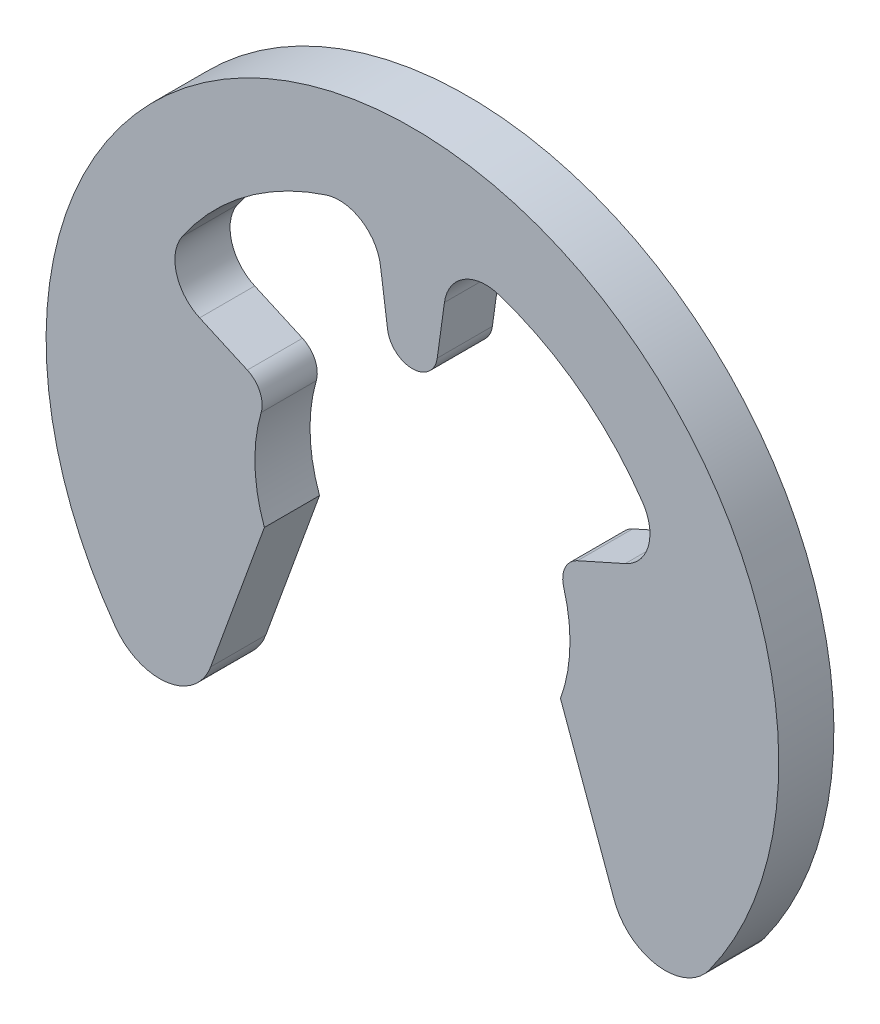
ISO-10303-21;
HEADER;
FILE_DESCRIPTION(('STEP AP214'),'2;1');
FILE_NAME('part.step','',(''),(''),'','','');
FILE_SCHEMA(('AUTOMOTIVE_DESIGN { 1 0 10303 214 1 1 1 1 }'));
ENDSEC;
DATA;
#1=APPLICATION_CONTEXT('core data for automotive mechanical design processes');
#2=APPLICATION_PROTOCOL_DEFINITION('international standard','automotive_design',2000,#1);
#3=PRODUCT_CONTEXT('',#1,'mechanical');
#4=PRODUCT('Part','Part','',(#3));
#5=PRODUCT_RELATED_PRODUCT_CATEGORY('part','',(#4));
#6=PRODUCT_DEFINITION_FORMATION('','',#4);
#7=PRODUCT_DEFINITION_CONTEXT('part definition',#1,'design');
#8=PRODUCT_DEFINITION('design','',#6,#7);
#9=PRODUCT_DEFINITION_SHAPE('','',#8);
#10=(LENGTH_UNIT() NAMED_UNIT(*) SI_UNIT(.MILLI.,.METRE.));
#11=(NAMED_UNIT(*) PLANE_ANGLE_UNIT() SI_UNIT($,.RADIAN.));
#12=(NAMED_UNIT(*) SI_UNIT($,.STERADIAN.) SOLID_ANGLE_UNIT());
#13=UNCERTAINTY_MEASURE_WITH_UNIT(LENGTH_MEASURE(1.E-05),#10,'distance_accuracy_value','');
#14=(GEOMETRIC_REPRESENTATION_CONTEXT(3) GLOBAL_UNCERTAINTY_ASSIGNED_CONTEXT((#13)) GLOBAL_UNIT_ASSIGNED_CONTEXT((#10,
#11,#12)) REPRESENTATION_CONTEXT('',''));
#15=CARTESIAN_POINT('',(0.,0.,0.));
#16=DIRECTION('',(0.,0.,1.));
#17=DIRECTION('',(1.,0.,0.));
#18=AXIS2_PLACEMENT_3D('',#15,#16,#17);
#19=CARTESIAN_POINT('',(-3.20885663929472,-2.3222316999934,-0.7));
#20=DIRECTION('',(0.,0.,1.));
#21=DIRECTION('',(1.,0.,0.));
#22=AXIS2_PLACEMENT_3D('',#19,#20,#21);
#23=CYLINDRICAL_SURFACE('',#22,0.689000000000002);
#24=CARTESIAN_POINT('',(-3.20885663929472,-2.3222316999934,0.));
#25=DIRECTION('',(0.,0.,1.));
#26=DIRECTION('',(1.,0.,0.));
#27=AXIS2_PLACEMENT_3D('',#24,#25,#26);
#28=CIRCLE('',#27,0.689000000000002);
#29=CARTESIAN_POINT('',(-3.76702433040152,-2.7261745531354,0.));
#30=VERTEX_POINT('',#29);
#31=CARTESIAN_POINT('',(-2.56140842357322,-2.55788357874478,0.));
#32=VERTEX_POINT('',#31);
#33=EDGE_CURVE('E204',#30,#32,#28,.T.);
#34=ORIENTED_EDGE('',*,*,#33,.F.);
#35=DIRECTION('',(0.,0.,1.));
#36=VECTOR('',#35,1.);
#37=CARTESIAN_POINT('',(-3.76702433040152,-2.7261745531354,-0.7));
#38=LINE('',#37,#36);
#39=CARTESIAN_POINT('',(-3.76702433040152,-2.7261745531354,-0.7));
#40=VERTEX_POINT('',#39);
#41=EDGE_CURVE('E11',#40,#30,#38,.T.);
#42=ORIENTED_EDGE('',*,*,#41,.F.);
#43=CARTESIAN_POINT('',(-3.20885663929472,-2.3222316999934,-0.7));
#44=DIRECTION('',(0.,0.,1.));
#45=DIRECTION('',(1.,0.,0.));
#46=AXIS2_PLACEMENT_3D('',#43,#44,#45);
#47=CIRCLE('',#46,0.689000000000002);
#48=CARTESIAN_POINT('',(-2.56140842357322,-2.55788357874478,-0.7));
#49=VERTEX_POINT('',#48);
#50=EDGE_CURVE('E260',#40,#49,#47,.T.);
#51=ORIENTED_EDGE('',*,*,#50,.T.);
#52=DIRECTION('',(0.,0.,1.));
#53=VECTOR('',#52,1.);
#54=CARTESIAN_POINT('',(-2.56140842357322,-2.55788357874478,-0.7));
#55=LINE('',#54,#53);
#56=EDGE_CURVE('E38',#49,#32,#55,.T.);
#57=ORIENTED_EDGE('',*,*,#56,.T.);
#58=EDGE_LOOP('',(#34,#42,#51,#57));
#59=FACE_BOUND('',#58,.T.);
#60=ADVANCED_FACE('F35',(#59),#23,.T.);
#61=CARTESIAN_POINT('',(0.,0.,-0.7));
#62=DIRECTION('',(0.,0.,1.));
#63=DIRECTION('',(1.,0.,0.));
#64=AXIS2_PLACEMENT_3D('',#61,#62,#63);
#65=CYLINDRICAL_SURFACE('',#64,4.65);
#66=CARTESIAN_POINT('',(0.,0.,0.));
#67=DIRECTION('',(0.,0.,1.));
#68=DIRECTION('',(1.,0.,0.));
#69=AXIS2_PLACEMENT_3D('',#66,#67,#68);
#70=CIRCLE('',#69,4.65);
#71=CARTESIAN_POINT('',(3.76702433040152,-2.7261745531354,0.));
#72=VERTEX_POINT('',#71);
#73=EDGE_CURVE('E258',#72,#30,#70,.T.);
#74=ORIENTED_EDGE('',*,*,#73,.F.);
#75=DIRECTION('',(0.,0.,1.));
#76=VECTOR('',#75,1.);
#77=CARTESIAN_POINT('',(3.76702433040152,-2.7261745531354,-0.7));
#78=LINE('',#77,#76);
#79=CARTESIAN_POINT('',(3.76702433040152,-2.7261745531354,-0.7));
#80=VERTEX_POINT('',#79);
#81=EDGE_CURVE('E44',#80,#72,#78,.T.);
#82=ORIENTED_EDGE('',*,*,#81,.F.);
#83=CARTESIAN_POINT('',(0.,0.,-0.7));
#84=DIRECTION('',(0.,0.,1.));
#85=DIRECTION('',(1.,0.,0.));
#86=AXIS2_PLACEMENT_3D('',#83,#84,#85);
#87=CIRCLE('',#86,4.65);
#88=EDGE_CURVE('E194',#80,#40,#87,.T.);
#89=ORIENTED_EDGE('',*,*,#88,.T.);
#90=ORIENTED_EDGE('',*,*,#41,.T.);
#91=EDGE_LOOP('',(#74,#82,#89,#90));
#92=FACE_BOUND('',#91,.T.);
#93=ADVANCED_FACE('F296',(#92),#65,.T.);
#94=CARTESIAN_POINT('',(3.20885663929472,-2.3222316999934,-0.7));
#95=DIRECTION('',(0.,0.,1.));
#96=DIRECTION('',(1.,0.,0.));
#97=AXIS2_PLACEMENT_3D('',#94,#95,#96);
#98=CYLINDRICAL_SURFACE('',#97,0.689000000000001);
#99=CARTESIAN_POINT('',(3.20885663929472,-2.3222316999934,0.));
#100=DIRECTION('',(0.,0.,1.));
#101=DIRECTION('',(1.,0.,0.));
#102=AXIS2_PLACEMENT_3D('',#99,#100,#101);
#103=CIRCLE('',#102,0.689000000000001);
#104=CARTESIAN_POINT('',(2.56140842357323,-2.55788357874479,0.));
#105=VERTEX_POINT('',#104);
#106=EDGE_CURVE('E181',#105,#72,#103,.T.);
#107=ORIENTED_EDGE('',*,*,#106,.F.);
#108=DIRECTION('',(0.,0.,1.));
#109=VECTOR('',#108,1.);
#110=CARTESIAN_POINT('',(2.56140842357323,-2.55788357874479,-0.7));
#111=LINE('',#110,#109);
#112=CARTESIAN_POINT('',(2.56140842357323,-2.55788357874479,-0.7));
#113=VERTEX_POINT('',#112);
#114=EDGE_CURVE('E176',#113,#105,#111,.T.);
#115=ORIENTED_EDGE('',*,*,#114,.F.);
#116=CARTESIAN_POINT('',(3.20885663929472,-2.3222316999934,-0.7));
#117=DIRECTION('',(0.,0.,1.));
#118=DIRECTION('',(1.,0.,0.));
#119=AXIS2_PLACEMENT_3D('',#116,#117,#118);
#120=CIRCLE('',#119,0.689000000000001);
#121=EDGE_CURVE('E179',#113,#80,#120,.T.);
#122=ORIENTED_EDGE('',*,*,#121,.T.);
#123=ORIENTED_EDGE('',*,*,#81,.T.);
#124=EDGE_LOOP('',(#107,#115,#122,#123));
#125=FACE_BOUND('',#124,.T.);
#126=ADVANCED_FACE('F178',(#125),#98,.T.);
#127=CARTESIAN_POINT('',(1.87938524157182,-0.684040286651337,-0.7));
#128=DIRECTION('',(-0.939692620785908,-0.34202014332567,0.));
#129=DIRECTION('',(0.34202014332567,-0.939692620785908,0.));
#130=AXIS2_PLACEMENT_3D('',#127,#128,#129);
#131=PLANE('',#130);
#132=DIRECTION('',(0.34202014332567,-0.939692620785908,0.));
#133=VECTOR('',#132,1.);
#134=CARTESIAN_POINT('',(1.87938524157182,-0.684040286651337,0.));
#135=LINE('',#134,#133);
#136=CARTESIAN_POINT('',(1.87938524157182,-0.684040286651337,0.));
#137=VERTEX_POINT('',#136);
#138=EDGE_CURVE('E255',#137,#105,#135,.T.);
#139=ORIENTED_EDGE('',*,*,#138,.F.);
#140=DIRECTION('',(0.,0.,1.));
#141=VECTOR('',#140,1.);
#142=CARTESIAN_POINT('',(1.87938524157182,-0.684040286651337,-0.7));
#143=LINE('',#142,#141);
#144=CARTESIAN_POINT('',(1.87938524157182,-0.684040286651337,-0.7));
#145=VERTEX_POINT('',#144);
#146=EDGE_CURVE('E186',#145,#137,#143,.T.);
#147=ORIENTED_EDGE('',*,*,#146,.F.);
#148=DIRECTION('',(0.34202014332567,-0.939692620785908,0.));
#149=VECTOR('',#148,1.);
#150=CARTESIAN_POINT('',(1.87938524157182,-0.684040286651337,-0.7));
#151=LINE('',#150,#149);
#152=EDGE_CURVE('E192',#145,#113,#151,.T.);
#153=ORIENTED_EDGE('',*,*,#152,.T.);
#154=ORIENTED_EDGE('',*,*,#114,.T.);
#155=EDGE_LOOP('',(#139,#147,#153,#154));
#156=FACE_BOUND('',#155,.T.);
#157=ADVANCED_FACE('F196',(#156),#131,.T.);
#158=CARTESIAN_POINT('',(0.,0.,-0.7));
#159=DIRECTION('',(0.,0.,1.));
#160=DIRECTION('',(1.,0.,0.));
#161=AXIS2_PLACEMENT_3D('',#158,#159,#160);
#162=CYLINDRICAL_SURFACE('',#161,2.);
#163=CARTESIAN_POINT('',(0.,0.,0.));
#164=DIRECTION('',(0.,0.,-1.));
#165=DIRECTION('',(-1.,0.,0.));
#166=AXIS2_PLACEMENT_3D('',#163,#164,#165);
#167=CIRCLE('',#166,2.);
#168=CARTESIAN_POINT('',(1.92029721087416,0.558979983459972,0.));
#169=VERTEX_POINT('',#168);
#170=EDGE_CURVE('E252',#169,#137,#167,.T.);
#171=ORIENTED_EDGE('',*,*,#170,.F.);
#172=DIRECTION('',(0.,0.,1.));
#173=VECTOR('',#172,1.);
#174=CARTESIAN_POINT('',(1.92029721087416,0.558979983459972,-0.7));
#175=LINE('',#174,#173);
#176=CARTESIAN_POINT('',(1.92029721087416,0.558979983459972,-0.7));
#177=VERTEX_POINT('',#176);
#178=EDGE_CURVE('E264',#177,#169,#175,.T.);
#179=ORIENTED_EDGE('',*,*,#178,.F.);
#180=CARTESIAN_POINT('',(0.,0.,-0.7));
#181=DIRECTION('',(0.,0.,-1.));
#182=DIRECTION('',(-1.,0.,0.));
#183=AXIS2_PLACEMENT_3D('',#180,#181,#182);
#184=CIRCLE('',#183,2.);
#185=EDGE_CURVE('E197',#177,#145,#184,.T.);
#186=ORIENTED_EDGE('',*,*,#185,.T.);
#187=ORIENTED_EDGE('',*,*,#146,.T.);
#188=EDGE_LOOP('',(#171,#179,#186,#187));
#189=FACE_BOUND('',#188,.T.);
#190=ADVANCED_FACE('F309',(#189),#162,.F.);
#191=CARTESIAN_POINT('',(2.22562446740316,0.647857800830108,-0.7));
#192=DIRECTION('',(0.,0.,1.));
#193=DIRECTION('',(1.,0.,0.));
#194=AXIS2_PLACEMENT_3D('',#191,#192,#193);
#195=CYLINDRICAL_SURFACE('',#194,0.317999999999999);
#196=CARTESIAN_POINT('',(2.22562446740316,0.647857800830108,0.));
#197=DIRECTION('',(0.,0.,1.));
#198=DIRECTION('',(1.,0.,0.));
#199=AXIS2_PLACEMENT_3D('',#196,#197,#198);
#200=CIRCLE('',#199,0.317999999999999);
#201=CARTESIAN_POINT('',(2.09569997714688,0.938105327661339,0.));
#202=VERTEX_POINT('',#201);
#203=EDGE_CURVE('E249',#202,#169,#200,.T.);
#204=ORIENTED_EDGE('',*,*,#203,.F.);
#205=DIRECTION('',(0.,0.,1.));
#206=VECTOR('',#205,1.);
#207=CARTESIAN_POINT('',(2.09569997714688,0.938105327661339,-0.7));
#208=LINE('',#207,#206);
#209=CARTESIAN_POINT('',(2.09569997714688,0.938105327661339,-0.7));
#210=VERTEX_POINT('',#209);
#211=EDGE_CURVE('E266',#210,#202,#208,.T.);
#212=ORIENTED_EDGE('',*,*,#211,.F.);
#213=CARTESIAN_POINT('',(2.22562446740316,0.647857800830108,-0.7));
#214=DIRECTION('',(0.,0.,1.));
#215=DIRECTION('',(1.,0.,0.));
#216=AXIS2_PLACEMENT_3D('',#213,#214,#215);
#217=CIRCLE('',#216,0.317999999999999);
#218=EDGE_CURVE('E199',#210,#177,#217,.T.);
#219=ORIENTED_EDGE('',*,*,#218,.T.);
#220=ORIENTED_EDGE('',*,*,#178,.T.);
#221=EDGE_LOOP('',(#204,#212,#219,#220));
#222=FACE_BOUND('',#221,.T.);
#223=ADVANCED_FACE('F312',(#222),#195,.T.);
#224=CARTESIAN_POINT('',(2.70160555777763,1.20932890901733,-0.7));
#225=DIRECTION('',(-0.408567579422264,0.912728071796322,0.));
#226=DIRECTION('',(-0.912728071796322,-0.408567579422264,0.));
#227=AXIS2_PLACEMENT_3D('',#224,#225,#226);
#228=PLANE('',#227);
#229=DIRECTION('',(-0.912728071796322,-0.408567579422264,0.));
#230=VECTOR('',#229,1.);
#231=CARTESIAN_POINT('',(2.70160555777763,1.20932890901733,0.));
#232=LINE('',#231,#230);
#233=CARTESIAN_POINT('',(2.70160555777763,1.20932890901733,0.));
#234=VERTEX_POINT('',#233);
#235=EDGE_CURVE('E246',#234,#202,#232,.T.);
#236=ORIENTED_EDGE('',*,*,#235,.F.);
#237=DIRECTION('',(0.,0.,1.));
#238=VECTOR('',#237,1.);
#239=CARTESIAN_POINT('',(2.70160555777763,1.20932890901733,-0.7));
#240=LINE('',#239,#238);
#241=CARTESIAN_POINT('',(2.70160555777763,1.20932890901733,-0.7));
#242=VERTEX_POINT('',#241);
#243=EDGE_CURVE('E268',#242,#234,#240,.T.);
#244=ORIENTED_EDGE('',*,*,#243,.F.);
#245=DIRECTION('',(-0.912728071796322,-0.408567579422264,0.));
#246=VECTOR('',#245,1.);
#247=CARTESIAN_POINT('',(2.70160555777763,1.20932890901733,-0.7));
#248=LINE('',#247,#246);
#249=EDGE_CURVE('E551',#242,#210,#248,.T.);
#250=ORIENTED_EDGE('',*,*,#249,.T.);
#251=ORIENTED_EDGE('',*,*,#211,.T.);
#252=EDGE_LOOP('',(#236,#244,#250,#251));
#253=FACE_BOUND('',#252,.T.);
#254=ADVANCED_FACE('F316',(#253),#228,.T.);
#255=CARTESIAN_POINT('',(2.48506474068382,1.69307478706938,-0.7));
#256=DIRECTION('',(0.,0.,1.));
#257=DIRECTION('',(1.,0.,0.));
#258=AXIS2_PLACEMENT_3D('',#255,#256,#257);
#259=CYLINDRICAL_SURFACE('',#258,0.53);
#260=CARTESIAN_POINT('',(2.48506474068382,1.69307478706938,0.));
#261=DIRECTION('',(0.,0.,-1.));
#262=DIRECTION('',(-1.,0.,0.));
#263=AXIS2_PLACEMENT_3D('',#260,#261,#262);
#264=CIRCLE('',#263,0.53);
#265=CARTESIAN_POINT('',(2.92307083066136,1.99148836776335,0.));
#266=VERTEX_POINT('',#265);
#267=EDGE_CURVE('E243',#266,#234,#264,.T.);
#268=ORIENTED_EDGE('',*,*,#267,.F.);
#269=DIRECTION('',(0.,0.,1.));
#270=VECTOR('',#269,1.);
#271=CARTESIAN_POINT('',(2.92307083066136,1.99148836776335,-0.7));
#272=LINE('',#271,#270);
#273=CARTESIAN_POINT('',(2.92307083066136,1.99148836776335,-0.7));
#274=VERTEX_POINT('',#273);
#275=EDGE_CURVE('E270',#274,#266,#272,.T.);
#276=ORIENTED_EDGE('',*,*,#275,.F.);
#277=CARTESIAN_POINT('',(2.48506474068382,1.69307478706938,-0.7));
#278=DIRECTION('',(0.,0.,-1.));
#279=DIRECTION('',(-1.,0.,0.));
#280=AXIS2_PLACEMENT_3D('',#277,#278,#279);
#281=CIRCLE('',#280,0.53);
#282=EDGE_CURVE('E544',#274,#242,#281,.T.);
#283=ORIENTED_EDGE('',*,*,#282,.T.);
#284=ORIENTED_EDGE('',*,*,#243,.T.);
#285=EDGE_LOOP('',(#268,#276,#283,#284));
#286=FACE_BOUND('',#285,.T.);
#287=ADVANCED_FACE('F320',(#286),#259,.F.);
#288=CARTESIAN_POINT('',(0.,0.,-0.7));
#289=DIRECTION('',(0.,0.,1.));
#290=DIRECTION('',(1.,0.,0.));
#291=AXIS2_PLACEMENT_3D('',#288,#289,#290);
#292=CYLINDRICAL_SURFACE('',#291,3.537);
#293=CARTESIAN_POINT('',(0.,0.,0.));
#294=DIRECTION('',(0.,0.,-1.));
#295=DIRECTION('',(-1.,0.,0.));
#296=AXIS2_PLACEMENT_3D('',#293,#294,#295);
#297=CIRCLE('',#296,3.537);
#298=CARTESIAN_POINT('',(1.09515573676445,3.36318344908985,0.));
#299=VERTEX_POINT('',#298);
#300=EDGE_CURVE('E240',#299,#266,#297,.T.);
#301=ORIENTED_EDGE('',*,*,#300,.F.);
#302=DIRECTION('',(0.,0.,1.));
#303=VECTOR('',#302,1.);
#304=CARTESIAN_POINT('',(1.09515573676445,3.36318344908985,-0.7));
#305=LINE('',#304,#303);
#306=CARTESIAN_POINT('',(1.09515573676445,3.36318344908985,-0.7));
#307=VERTEX_POINT('',#306);
#308=EDGE_CURVE('E272',#307,#299,#305,.T.);
#309=ORIENTED_EDGE('',*,*,#308,.F.);
#310=CARTESIAN_POINT('',(0.,0.,-0.7));
#311=DIRECTION('',(0.,0.,-1.));
#312=DIRECTION('',(-1.,0.,0.));
#313=AXIS2_PLACEMENT_3D('',#310,#311,#312);
#314=CIRCLE('',#313,3.537);
#315=EDGE_CURVE('E540',#307,#274,#314,.T.);
#316=ORIENTED_EDGE('',*,*,#315,.T.);
#317=ORIENTED_EDGE('',*,*,#275,.T.);
#318=EDGE_LOOP('',(#301,#309,#316,#317));
#319=FACE_BOUND('',#318,.T.);
#320=ADVANCED_FACE('F324',(#319),#292,.F.);
#321=CARTESIAN_POINT('',(0.931052671883147,2.85922890342471,-0.7));
#322=DIRECTION('',(0.,0.,1.));
#323=DIRECTION('',(1.,0.,0.));
#324=AXIS2_PLACEMENT_3D('',#321,#322,#323);
#325=CYLINDRICAL_SURFACE('',#324,0.530000000000002);
#326=CARTESIAN_POINT('',(0.931052671883147,2.85922890342471,0.));
#327=DIRECTION('',(0.,0.,-1.));
#328=DIRECTION('',(-1.,0.,0.));
#329=AXIS2_PLACEMENT_3D('',#326,#327,#328);
#330=CIRCLE('',#329,0.530000000000002);
#331=CARTESIAN_POINT('',(0.406063750506783,2.93193813552134,0.));
#332=VERTEX_POINT('',#331);
#333=EDGE_CURVE('E237',#332,#299,#330,.T.);
#334=ORIENTED_EDGE('',*,*,#333,.F.);
#335=DIRECTION('',(0.,0.,1.));
#336=VECTOR('',#335,1.);
#337=CARTESIAN_POINT('',(0.406063750506783,2.93193813552134,-0.7));
#338=LINE('',#337,#336);
#339=CARTESIAN_POINT('',(0.406063750506783,2.93193813552134,-0.7));
#340=VERTEX_POINT('',#339);
#341=EDGE_CURVE('E274',#340,#332,#338,.T.);
#342=ORIENTED_EDGE('',*,*,#341,.F.);
#343=CARTESIAN_POINT('',(0.931052671883147,2.85922890342471,-0.7));
#344=DIRECTION('',(0.,0.,-1.));
#345=DIRECTION('',(-1.,0.,0.));
#346=AXIS2_PLACEMENT_3D('',#343,#344,#345);
#347=CIRCLE('',#346,0.530000000000002);
#348=EDGE_CURVE('E556',#340,#307,#347,.T.);
#349=ORIENTED_EDGE('',*,*,#348,.T.);
#350=ORIENTED_EDGE('',*,*,#308,.T.);
#351=EDGE_LOOP('',(#334,#342,#349,#350));
#352=FACE_BOUND('',#351,.T.);
#353=ADVANCED_FACE('F328',(#352),#325,.F.);
#354=CARTESIAN_POINT('',(0.314993352825818,2.27437446074202,-0.7));
#355=DIRECTION('',(0.990545134672384,-0.137187230371011,0.));
#356=DIRECTION('',(0.137187230371011,0.990545134672384,0.));
#357=AXIS2_PLACEMENT_3D('',#354,#355,#356);
#358=PLANE('',#357);
#359=DIRECTION('',(0.137187230371011,0.990545134672384,0.));
#360=VECTOR('',#359,1.);
#361=CARTESIAN_POINT('',(0.314993352825818,2.27437446074202,0.));
#362=LINE('',#361,#360);
#363=CARTESIAN_POINT('',(0.314993352825818,2.27437446074202,0.));
#364=VERTEX_POINT('',#363);
#365=EDGE_CURVE('E234',#364,#332,#362,.T.);
#366=ORIENTED_EDGE('',*,*,#365,.F.);
#367=DIRECTION('',(0.,0.,1.));
#368=VECTOR('',#367,1.);
#369=CARTESIAN_POINT('',(0.314993352825818,2.27437446074202,-0.7));
#370=LINE('',#369,#368);
#371=CARTESIAN_POINT('',(0.314993352825818,2.27437446074202,-0.7));
#372=VERTEX_POINT('',#371);
#373=EDGE_CURVE('E276',#372,#364,#370,.T.);
#374=ORIENTED_EDGE('',*,*,#373,.F.);
#375=DIRECTION('',(0.137187230371011,0.990545134672384,0.));
#376=VECTOR('',#375,1.);
#377=CARTESIAN_POINT('',(0.314993352825818,2.27437446074202,-0.7));
#378=LINE('',#377,#376);
#379=EDGE_CURVE('E533',#372,#340,#378,.T.);
#380=ORIENTED_EDGE('',*,*,#379,.T.);
#381=ORIENTED_EDGE('',*,*,#341,.T.);
#382=EDGE_LOOP('',(#366,#374,#380,#381));
#383=FACE_BOUND('',#382,.T.);
#384=ADVANCED_FACE('F332',(#383),#358,.T.);
#385=CARTESIAN_POINT('',(0.,2.318,-0.7));
#386=DIRECTION('',(0.,0.,1.));
#387=DIRECTION('',(1.,0.,0.));
#388=AXIS2_PLACEMENT_3D('',#385,#386,#387);
#389=CYLINDRICAL_SURFACE('',#388,0.318);
#390=CARTESIAN_POINT('',(0.,2.318,0.));
#391=DIRECTION('',(0.,0.,1.));
#392=DIRECTION('',(1.,0.,0.));
#393=AXIS2_PLACEMENT_3D('',#390,#391,#392);
#394=CIRCLE('',#393,0.318);
#395=CARTESIAN_POINT('',(-0.314993352825818,2.27437446074202,0.));
#396=VERTEX_POINT('',#395);
#397=EDGE_CURVE('E231',#396,#364,#394,.T.);
#398=ORIENTED_EDGE('',*,*,#397,.F.);
#399=DIRECTION('',(0.,0.,1.));
#400=VECTOR('',#399,1.);
#401=CARTESIAN_POINT('',(-0.314993352825818,2.27437446074202,-0.7));
#402=LINE('',#401,#400);
#403=CARTESIAN_POINT('',(-0.314993352825818,2.27437446074202,-0.7));
#404=VERTEX_POINT('',#403);
#405=EDGE_CURVE('E278',#404,#396,#402,.T.);
#406=ORIENTED_EDGE('',*,*,#405,.F.);
#407=CARTESIAN_POINT('',(0.,2.318,-0.7));
#408=DIRECTION('',(0.,0.,1.));
#409=DIRECTION('',(1.,0.,0.));
#410=AXIS2_PLACEMENT_3D('',#407,#408,#409);
#411=CIRCLE('',#410,0.318);
#412=EDGE_CURVE('E529',#404,#372,#411,.T.);
#413=ORIENTED_EDGE('',*,*,#412,.T.);
#414=ORIENTED_EDGE('',*,*,#373,.T.);
#415=EDGE_LOOP('',(#398,#406,#413,#414));
#416=FACE_BOUND('',#415,.T.);
#417=ADVANCED_FACE('F336',(#416),#389,.T.);
#418=CARTESIAN_POINT('',(-0.406063750506782,2.93193813552134,-0.7));
#419=DIRECTION('',(-0.990545134672384,-0.137187230371009,0.));
#420=DIRECTION('',(0.137187230371009,-0.990545134672384,0.));
#421=AXIS2_PLACEMENT_3D('',#418,#419,#420);
#422=PLANE('',#421);
#423=DIRECTION('',(0.137187230371009,-0.990545134672384,0.));
#424=VECTOR('',#423,1.);
#425=CARTESIAN_POINT('',(-0.406063750506782,2.93193813552134,0.));
#426=LINE('',#425,#424);
#427=CARTESIAN_POINT('',(-0.406063750506783,2.93193813552134,0.));
#428=VERTEX_POINT('',#427);
#429=EDGE_CURVE('E228',#428,#396,#426,.T.);
#430=ORIENTED_EDGE('',*,*,#429,.F.);
#431=DIRECTION('',(0.,0.,1.));
#432=VECTOR('',#431,1.);
#433=CARTESIAN_POINT('',(-0.406063750506783,2.93193813552134,-0.7));
#434=LINE('',#433,#432);
#435=CARTESIAN_POINT('',(-0.406063750506783,2.93193813552134,-0.7));
#436=VERTEX_POINT('',#435);
#437=EDGE_CURVE('E280',#436,#428,#434,.T.);
#438=ORIENTED_EDGE('',*,*,#437,.F.);
#439=DIRECTION('',(0.137187230371009,-0.990545134672384,0.));
#440=VECTOR('',#439,1.);
#441=CARTESIAN_POINT('',(-0.406063750506782,2.93193813552134,-0.7));
#442=LINE('',#441,#440);
#443=EDGE_CURVE('E560',#436,#404,#442,.T.);
#444=ORIENTED_EDGE('',*,*,#443,.T.);
#445=ORIENTED_EDGE('',*,*,#405,.T.);
#446=EDGE_LOOP('',(#430,#438,#444,#445));
#447=FACE_BOUND('',#446,.T.);
#448=ADVANCED_FACE('F340',(#447),#422,.T.);
#449=CARTESIAN_POINT('',(-0.931052671883146,2.85922890342471,-0.7));
#450=DIRECTION('',(0.,0.,1.));
#451=DIRECTION('',(1.,0.,0.));
#452=AXIS2_PLACEMENT_3D('',#449,#450,#451);
#453=CYLINDRICAL_SURFACE('',#452,0.529999999999999);
#454=CARTESIAN_POINT('',(-0.931052671883146,2.85922890342471,0.));
#455=DIRECTION('',(0.,0.,-1.));
#456=DIRECTION('',(-1.,0.,0.));
#457=AXIS2_PLACEMENT_3D('',#454,#455,#456);
#458=CIRCLE('',#457,0.529999999999999);
#459=CARTESIAN_POINT('',(-1.09515573676444,3.36318344908985,0.));
#460=VERTEX_POINT('',#459);
#461=EDGE_CURVE('E225',#460,#428,#458,.T.);
#462=ORIENTED_EDGE('',*,*,#461,.F.);
#463=DIRECTION('',(0.,0.,1.));
#464=VECTOR('',#463,1.);
#465=CARTESIAN_POINT('',(-1.09515573676444,3.36318344908985,-0.7));
#466=LINE('',#465,#464);
#467=CARTESIAN_POINT('',(-1.09515573676444,3.36318344908985,-0.7));
#468=VERTEX_POINT('',#467);
#469=EDGE_CURVE('E282',#468,#460,#466,.T.);
#470=ORIENTED_EDGE('',*,*,#469,.F.);
#471=CARTESIAN_POINT('',(-0.931052671883146,2.85922890342471,-0.7));
#472=DIRECTION('',(0.,0.,-1.));
#473=DIRECTION('',(-1.,0.,0.));
#474=AXIS2_PLACEMENT_3D('',#471,#472,#473);
#475=CIRCLE('',#474,0.529999999999999);
#476=EDGE_CURVE('E522',#468,#436,#475,.T.);
#477=ORIENTED_EDGE('',*,*,#476,.T.);
#478=ORIENTED_EDGE('',*,*,#437,.T.);
#479=EDGE_LOOP('',(#462,#470,#477,#478));
#480=FACE_BOUND('',#479,.T.);
#481=ADVANCED_FACE('F344',(#480),#453,.F.);
#482=CARTESIAN_POINT('',(0.,0.,-0.7));
#483=DIRECTION('',(0.,0.,1.));
#484=DIRECTION('',(1.,0.,0.));
#485=AXIS2_PLACEMENT_3D('',#482,#483,#484);
#486=CYLINDRICAL_SURFACE('',#485,3.537);
#487=CARTESIAN_POINT('',(0.,0.,0.));
#488=DIRECTION('',(0.,0.,-1.));
#489=DIRECTION('',(-1.,0.,0.));
#490=AXIS2_PLACEMENT_3D('',#487,#488,#489);
#491=CIRCLE('',#490,3.537);
#492=CARTESIAN_POINT('',(-2.92307083066135,1.99148836776335,0.));
#493=VERTEX_POINT('',#492);
#494=EDGE_CURVE('E222',#493,#460,#491,.T.);
#495=ORIENTED_EDGE('',*,*,#494,.F.);
#496=DIRECTION('',(0.,0.,1.));
#497=VECTOR('',#496,1.);
#498=CARTESIAN_POINT('',(-2.92307083066135,1.99148836776335,-0.7));
#499=LINE('',#498,#497);
#500=CARTESIAN_POINT('',(-2.92307083066135,1.99148836776335,-0.7));
#501=VERTEX_POINT('',#500);
#502=EDGE_CURVE('E284',#501,#493,#499,.T.);
#503=ORIENTED_EDGE('',*,*,#502,.F.);
#504=CARTESIAN_POINT('',(0.,0.,-0.7));
#505=DIRECTION('',(0.,0.,-1.));
#506=DIRECTION('',(-1.,0.,0.));
#507=AXIS2_PLACEMENT_3D('',#504,#505,#506);
#508=CIRCLE('',#507,3.537);
#509=EDGE_CURVE('E518',#501,#468,#508,.T.);
#510=ORIENTED_EDGE('',*,*,#509,.T.);
#511=ORIENTED_EDGE('',*,*,#469,.T.);
#512=EDGE_LOOP('',(#495,#503,#510,#511));
#513=FACE_BOUND('',#512,.T.);
#514=ADVANCED_FACE('F348',(#513),#486,.F.);
#515=CARTESIAN_POINT('',(-2.48506474068382,1.69307478706938,-0.7));
#516=DIRECTION('',(0.,0.,1.));
#517=DIRECTION('',(1.,0.,0.));
#518=AXIS2_PLACEMENT_3D('',#515,#516,#517);
#519=CYLINDRICAL_SURFACE('',#518,0.53);
#520=CARTESIAN_POINT('',(-2.48506474068382,1.69307478706938,0.));
#521=DIRECTION('',(0.,0.,-1.));
#522=DIRECTION('',(-1.,0.,0.));
#523=AXIS2_PLACEMENT_3D('',#520,#521,#522);
#524=CIRCLE('',#523,0.53);
#525=CARTESIAN_POINT('',(-2.70160555777763,1.20932890901733,0.));
#526=VERTEX_POINT('',#525);
#527=EDGE_CURVE('E219',#526,#493,#524,.T.);
#528=ORIENTED_EDGE('',*,*,#527,.F.);
#529=DIRECTION('',(0.,0.,1.));
#530=VECTOR('',#529,1.);
#531=CARTESIAN_POINT('',(-2.70160555777763,1.20932890901733,-0.7));
#532=LINE('',#531,#530);
#533=CARTESIAN_POINT('',(-2.70160555777763,1.20932890901733,-0.7));
#534=VERTEX_POINT('',#533);
#535=EDGE_CURVE('E286',#534,#526,#532,.T.);
#536=ORIENTED_EDGE('',*,*,#535,.F.);
#537=CARTESIAN_POINT('',(-2.48506474068382,1.69307478706938,-0.7));
#538=DIRECTION('',(0.,0.,-1.));
#539=DIRECTION('',(-1.,0.,0.));
#540=AXIS2_PLACEMENT_3D('',#537,#538,#539);
#541=CIRCLE('',#540,0.53);
#542=EDGE_CURVE('E564',#534,#501,#541,.T.);
#543=ORIENTED_EDGE('',*,*,#542,.T.);
#544=ORIENTED_EDGE('',*,*,#502,.T.);
#545=EDGE_LOOP('',(#528,#536,#543,#544));
#546=FACE_BOUND('',#545,.T.);
#547=ADVANCED_FACE('F352',(#546),#519,.F.);
#548=CARTESIAN_POINT('',(-2.09569997714688,0.938105327661339,-0.7));
#549=DIRECTION('',(0.408567579422264,0.912728071796322,0.));
#550=DIRECTION('',(-0.912728071796322,0.408567579422264,0.));
#551=AXIS2_PLACEMENT_3D('',#548,#549,#550);
#552=PLANE('',#551);
#553=DIRECTION('',(-0.912728071796322,0.408567579422264,0.));
#554=VECTOR('',#553,1.);
#555=CARTESIAN_POINT('',(-2.09569997714688,0.938105327661339,0.));
#556=LINE('',#555,#554);
#557=CARTESIAN_POINT('',(-2.09569997714688,0.938105327661338,0.));
#558=VERTEX_POINT('',#557);
#559=EDGE_CURVE('E216',#558,#526,#556,.T.);
#560=ORIENTED_EDGE('',*,*,#559,.F.);
#561=DIRECTION('',(0.,0.,1.));
#562=VECTOR('',#561,1.);
#563=CARTESIAN_POINT('',(-2.09569997714688,0.938105327661338,-0.7));
#564=LINE('',#563,#562);
#565=CARTESIAN_POINT('',(-2.09569997714688,0.938105327661338,-0.7));
#566=VERTEX_POINT('',#565);
#567=EDGE_CURVE('E288',#566,#558,#564,.T.);
#568=ORIENTED_EDGE('',*,*,#567,.F.);
#569=DIRECTION('',(-0.912728071796322,0.408567579422264,0.));
#570=VECTOR('',#569,1.);
#571=CARTESIAN_POINT('',(-2.09569997714688,0.938105327661339,-0.7));
#572=LINE('',#571,#570);
#573=EDGE_CURVE('E511',#566,#534,#572,.T.);
#574=ORIENTED_EDGE('',*,*,#573,.T.);
#575=ORIENTED_EDGE('',*,*,#535,.T.);
#576=EDGE_LOOP('',(#560,#568,#574,#575));
#577=FACE_BOUND('',#576,.T.);
#578=ADVANCED_FACE('F356',(#577),#552,.T.);
#579=CARTESIAN_POINT('',(-2.22562446740316,0.647857800830108,-0.7));
#580=DIRECTION('',(0.,0.,1.));
#581=DIRECTION('',(1.,0.,0.));
#582=AXIS2_PLACEMENT_3D('',#579,#580,#581);
#583=CYLINDRICAL_SURFACE('',#582,0.317999999999999);
#584=CARTESIAN_POINT('',(-2.22562446740316,0.647857800830108,0.));
#585=DIRECTION('',(0.,0.,1.));
#586=DIRECTION('',(1.,0.,0.));
#587=AXIS2_PLACEMENT_3D('',#584,#585,#586);
#588=CIRCLE('',#587,0.317999999999999);
#589=CARTESIAN_POINT('',(-1.92029721087416,0.558979983459973,0.));
#590=VERTEX_POINT('',#589);
#591=EDGE_CURVE('E213',#590,#558,#588,.T.);
#592=ORIENTED_EDGE('',*,*,#591,.F.);
#593=DIRECTION('',(0.,0.,1.));
#594=VECTOR('',#593,1.);
#595=CARTESIAN_POINT('',(-1.92029721087416,0.558979983459973,-0.7));
#596=LINE('',#595,#594);
#597=CARTESIAN_POINT('',(-1.92029721087416,0.558979983459973,-0.7));
#598=VERTEX_POINT('',#597);
#599=EDGE_CURVE('E290',#598,#590,#596,.T.);
#600=ORIENTED_EDGE('',*,*,#599,.F.);
#601=CARTESIAN_POINT('',(-2.22562446740316,0.647857800830108,-0.7));
#602=DIRECTION('',(0.,0.,1.));
#603=DIRECTION('',(1.,0.,0.));
#604=AXIS2_PLACEMENT_3D('',#601,#602,#603);
#605=CIRCLE('',#604,0.317999999999999);
#606=EDGE_CURVE('E507',#598,#566,#605,.T.);
#607=ORIENTED_EDGE('',*,*,#606,.T.);
#608=ORIENTED_EDGE('',*,*,#567,.T.);
#609=EDGE_LOOP('',(#592,#600,#607,#608));
#610=FACE_BOUND('',#609,.T.);
#611=ADVANCED_FACE('F360',(#610),#583,.T.);
#612=CARTESIAN_POINT('',(0.,0.,-0.7));
#613=DIRECTION('',(0.,0.,1.));
#614=DIRECTION('',(1.,0.,0.));
#615=AXIS2_PLACEMENT_3D('',#612,#613,#614);
#616=CYLINDRICAL_SURFACE('',#615,2.);
#617=CARTESIAN_POINT('',(0.,0.,0.));
#618=DIRECTION('',(0.,0.,-1.));
#619=DIRECTION('',(-1.,0.,0.));
#620=AXIS2_PLACEMENT_3D('',#617,#618,#619);
#621=CIRCLE('',#620,2.);
#622=CARTESIAN_POINT('',(-1.87938524157182,-0.684040286651337,0.));
#623=VERTEX_POINT('',#622);
#624=EDGE_CURVE('E210',#623,#590,#621,.T.);
#625=ORIENTED_EDGE('',*,*,#624,.F.);
#626=DIRECTION('',(0.,0.,1.));
#627=VECTOR('',#626,1.);
#628=CARTESIAN_POINT('',(-1.87938524157182,-0.684040286651337,-0.7));
#629=LINE('',#628,#627);
#630=CARTESIAN_POINT('',(-1.87938524157182,-0.684040286651337,-0.7));
#631=VERTEX_POINT('',#630);
#632=EDGE_CURVE('E291',#631,#623,#629,.T.);
#633=ORIENTED_EDGE('',*,*,#632,.F.);
#634=CARTESIAN_POINT('',(0.,0.,-0.7));
#635=DIRECTION('',(0.,0.,-1.));
#636=DIRECTION('',(-1.,0.,0.));
#637=AXIS2_PLACEMENT_3D('',#634,#635,#636);
#638=CIRCLE('',#637,2.);
#639=EDGE_CURVE('E568',#631,#598,#638,.T.);
#640=ORIENTED_EDGE('',*,*,#639,.T.);
#641=ORIENTED_EDGE('',*,*,#599,.T.);
#642=EDGE_LOOP('',(#625,#633,#640,#641));
#643=FACE_BOUND('',#642,.T.);
#644=ADVANCED_FACE('F364',(#643),#616,.F.);
#645=CARTESIAN_POINT('',(-2.56140842357322,-2.55788357874478,-0.7));
#646=DIRECTION('',(0.939692620785908,-0.342020143325669,0.));
#647=DIRECTION('',(0.342020143325669,0.939692620785908,0.));
#648=AXIS2_PLACEMENT_3D('',#645,#646,#647);
#649=PLANE('',#648);
#650=DIRECTION('',(0.342020143325669,0.939692620785908,0.));
#651=VECTOR('',#650,1.);
#652=CARTESIAN_POINT('',(-2.56140842357322,-2.55788357874478,0.));
#653=LINE('',#652,#651);
#654=EDGE_CURVE('E207',#32,#623,#653,.T.);
#655=ORIENTED_EDGE('',*,*,#654,.F.);
#656=ORIENTED_EDGE('',*,*,#56,.F.);
#657=DIRECTION('',(0.342020143325669,0.939692620785908,0.));
#658=VECTOR('',#657,1.);
#659=CARTESIAN_POINT('',(-2.56140842357322,-2.55788357874478,-0.7));
#660=LINE('',#659,#658);
#661=EDGE_CURVE('E570',#49,#631,#660,.T.);
#662=ORIENTED_EDGE('',*,*,#661,.T.);
#663=ORIENTED_EDGE('',*,*,#632,.T.);
#664=EDGE_LOOP('',(#655,#656,#662,#663));
#665=FACE_BOUND('',#664,.T.);
#666=ADVANCED_FACE('F293',(#665),#649,.T.);
#667=CARTESIAN_POINT('',(-3.20885663929472,-2.3222316999934,-0.7));
#668=DIRECTION('',(0.,0.,1.));
#669=DIRECTION('',(1.,0.,0.));
#670=AXIS2_PLACEMENT_3D('',#667,#668,#669);
#671=PLANE('',#670);
#672=ORIENTED_EDGE('',*,*,#50,.F.);
#673=ORIENTED_EDGE('',*,*,#88,.F.);
#674=ORIENTED_EDGE('',*,*,#121,.F.);
#675=ORIENTED_EDGE('',*,*,#152,.F.);
#676=ORIENTED_EDGE('',*,*,#185,.F.);
#677=ORIENTED_EDGE('',*,*,#218,.F.);
#678=ORIENTED_EDGE('',*,*,#249,.F.);
#679=ORIENTED_EDGE('',*,*,#282,.F.);
#680=ORIENTED_EDGE('',*,*,#315,.F.);
#681=ORIENTED_EDGE('',*,*,#348,.F.);
#682=ORIENTED_EDGE('',*,*,#379,.F.);
#683=ORIENTED_EDGE('',*,*,#412,.F.);
#684=ORIENTED_EDGE('',*,*,#443,.F.);
#685=ORIENTED_EDGE('',*,*,#476,.F.);
#686=ORIENTED_EDGE('',*,*,#509,.F.);
#687=ORIENTED_EDGE('',*,*,#542,.F.);
#688=ORIENTED_EDGE('',*,*,#573,.F.);
#689=ORIENTED_EDGE('',*,*,#606,.F.);
#690=ORIENTED_EDGE('',*,*,#639,.F.);
#691=ORIENTED_EDGE('',*,*,#661,.F.);
#692=EDGE_LOOP('',(#672,#673,#674,#675,#676,#677,#678,#679,#680,#681,#682,#683,#684,#685,#686,
#687,#688,#689,#690,#691));
#693=FACE_BOUND('',#692,.T.);
#694=ADVANCED_FACE('F190',(#693),#671,.F.);
#695=CARTESIAN_POINT('',(-3.20885663929472,-2.3222316999934,0.));
#696=DIRECTION('',(0.,0.,1.));
#697=DIRECTION('',(1.,0.,0.));
#698=AXIS2_PLACEMENT_3D('',#695,#696,#697);
#699=PLANE('',#698);
#700=ORIENTED_EDGE('',*,*,#33,.T.);
#701=ORIENTED_EDGE('',*,*,#654,.T.);
#702=ORIENTED_EDGE('',*,*,#624,.T.);
#703=ORIENTED_EDGE('',*,*,#591,.T.);
#704=ORIENTED_EDGE('',*,*,#559,.T.);
#705=ORIENTED_EDGE('',*,*,#527,.T.);
#706=ORIENTED_EDGE('',*,*,#494,.T.);
#707=ORIENTED_EDGE('',*,*,#461,.T.);
#708=ORIENTED_EDGE('',*,*,#429,.T.);
#709=ORIENTED_EDGE('',*,*,#397,.T.);
#710=ORIENTED_EDGE('',*,*,#365,.T.);
#711=ORIENTED_EDGE('',*,*,#333,.T.);
#712=ORIENTED_EDGE('',*,*,#300,.T.);
#713=ORIENTED_EDGE('',*,*,#267,.T.);
#714=ORIENTED_EDGE('',*,*,#235,.T.);
#715=ORIENTED_EDGE('',*,*,#203,.T.);
#716=ORIENTED_EDGE('',*,*,#170,.T.);
#717=ORIENTED_EDGE('',*,*,#138,.T.);
#718=ORIENTED_EDGE('',*,*,#106,.T.);
#719=ORIENTED_EDGE('',*,*,#73,.T.);
#720=EDGE_LOOP('',(#700,#701,#702,#703,#704,#705,#706,#707,#708,#709,#710,#711,#712,#713,#714,
#715,#716,#717,#718,#719));
#721=FACE_BOUND('',#720,.T.);
#722=ADVANCED_FACE('F295',(#721),#699,.T.);
#723=CLOSED_SHELL('',(#60,#93,#126,#157,#190,#223,#254,#287,#320,#353,#384,#417,#448,#481,#514,
#547,#578,#611,#644,#666,#694,#722));
#724=MANIFOLD_SOLID_BREP('B2',#723);
#725=ADVANCED_BREP_SHAPE_REPRESENTATION('',(#18,#724),#14);
#726=SHAPE_DEFINITION_REPRESENTATION(#9,#725);
ENDSEC;
END-ISO-10303-21;
